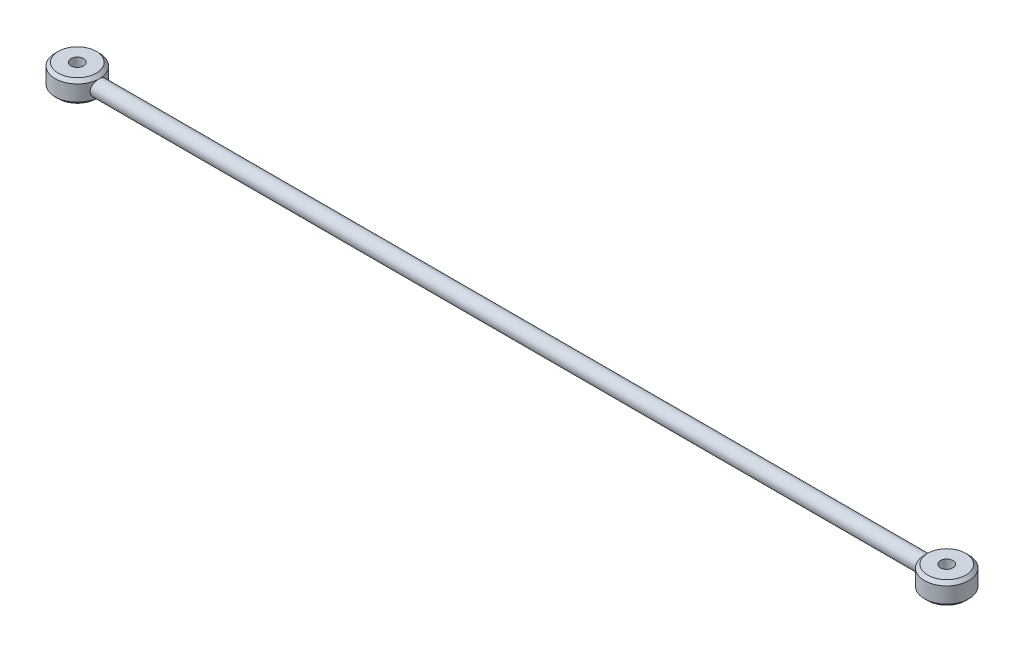
ISO-10303-21;
HEADER;
FILE_DESCRIPTION(('STEP AP214'),'2;1');
FILE_NAME('part.step','',(''),(''),'','','');
FILE_SCHEMA(('AUTOMOTIVE_DESIGN { 1 0 10303 214 1 1 1 1 }'));
ENDSEC;
DATA;
#1=APPLICATION_CONTEXT('core data for automotive mechanical design processes');
#2=APPLICATION_PROTOCOL_DEFINITION('international standard','automotive_design',2000,#1);
#3=PRODUCT_CONTEXT('',#1,'mechanical');
#4=PRODUCT('Part','Part','',(#3));
#5=PRODUCT_RELATED_PRODUCT_CATEGORY('part','',(#4));
#6=PRODUCT_DEFINITION_FORMATION('','',#4);
#7=PRODUCT_DEFINITION_CONTEXT('part definition',#1,'design');
#8=PRODUCT_DEFINITION('design','',#6,#7);
#9=PRODUCT_DEFINITION_SHAPE('','',#8);
#10=(LENGTH_UNIT() NAMED_UNIT(*) SI_UNIT(.MILLI.,.METRE.));
#11=(NAMED_UNIT(*) PLANE_ANGLE_UNIT() SI_UNIT($,.RADIAN.));
#12=(NAMED_UNIT(*) SI_UNIT($,.STERADIAN.) SOLID_ANGLE_UNIT());
#13=UNCERTAINTY_MEASURE_WITH_UNIT(LENGTH_MEASURE(1.E-05),#10,'distance_accuracy_value','');
#14=(GEOMETRIC_REPRESENTATION_CONTEXT(3) GLOBAL_UNCERTAINTY_ASSIGNED_CONTEXT((#13)) GLOBAL_UNIT_ASSIGNED_CONTEXT((#10,
#11,#12)) REPRESENTATION_CONTEXT('',''));
#15=CARTESIAN_POINT('',(0.,0.,0.));
#16=DIRECTION('',(0.,0.,1.));
#17=DIRECTION('',(1.,0.,0.));
#18=AXIS2_PLACEMENT_3D('',#15,#16,#17);
#19=CARTESIAN_POINT('',(0.,-3.5,0.));
#20=DIRECTION('',(0.,1.,0.));
#21=DIRECTION('',(0.,0.,1.));
#22=AXIS2_PLACEMENT_3D('',#19,#20,#21);
#23=CYLINDRICAL_SURFACE('',#22,7.);
#24=CARTESIAN_POINT('',(6.53834841531101,0.,-2.5));
#25=CARTESIAN_POINT('',(6.53834584824662,-0.135527062405663,-2.50000293142537));
#26=CARTESIAN_POINT('',(6.54260813914497,-0.271033863671456,-2.48894249442902));
#27=CARTESIAN_POINT('',(6.55909115270697,-0.537992919033548,-2.44517096849284));
#28=CARTESIAN_POINT('',(6.57131226844033,-0.669444972538477,-2.41245881021845));
#29=CARTESIAN_POINT('',(6.60215581723148,-0.924374759039168,-2.32671186637106));
#30=CARTESIAN_POINT('',(6.62076416275494,-1.04786933684221,-2.27372177606199));
#31=CARTESIAN_POINT('',(6.66226377845014,-1.28426086879935,-2.14907922668041));
#32=CARTESIAN_POINT('',(6.68515619613769,-1.39715497135356,-2.0774217654137));
#33=CARTESIAN_POINT('',(6.73379932254782,-1.61422119890982,-1.91402447589221));
#34=CARTESIAN_POINT('',(6.75962863426194,-1.71784786206316,-1.82158324114035));
#35=CARTESIAN_POINT('',(6.81057580348321,-1.90850684868181,-1.62073451198083));
#36=CARTESIAN_POINT('',(6.8356935259156,-1.99553603932801,-1.51232401016048));
#37=CARTESIAN_POINT('',(6.88331097797524,-2.15308908685254,-1.27854087761788));
#38=CARTESIAN_POINT('',(6.90570766813103,-2.22302949243019,-1.15275218770255));
#39=CARTESIAN_POINT('',(6.94442306763787,-2.34053505545395,-0.890255063415834));
#40=CARTESIAN_POINT('',(6.9607436747499,-2.38810720046781,-0.753550054799064));
#41=CARTESIAN_POINT('',(6.98491061598651,-2.45764094880007,-0.478828726649302));
#42=CARTESIAN_POINT('',(6.99306609346167,-2.48053956023552,-0.341077285205309));
#43=CARTESIAN_POINT('',(7.00108797904843,-2.50306838982769,-0.0634617212480525));
#44=CARTESIAN_POINT('',(7.0009568336799,-2.50270547565319,0.0764017655189457));
#45=CARTESIAN_POINT('',(6.99262260766838,-2.4792888024354,0.347592373494541));
#46=CARTESIAN_POINT('',(6.98478254135507,-2.4572554936179,0.479020651818556));
#47=CARTESIAN_POINT('',(6.96237851891869,-2.3928271488568,0.736174131701907));
#48=CARTESIAN_POINT('',(6.94781409330092,-2.35043069115005,0.861898934371373));
#49=CARTESIAN_POINT('',(6.91316507785892,-2.24595308417439,1.10616096680958));
#50=CARTESIAN_POINT('',(6.89300594264802,-2.18360423300557,1.22457268185839));
#51=CARTESIAN_POINT('',(6.84923357904069,-2.0412208599013,1.44953519587014));
#52=CARTESIAN_POINT('',(6.82561929883884,-1.96118094870148,1.55608236560633));
#53=CARTESIAN_POINT('',(6.77590353640076,-1.78066922406844,1.76033248031897));
#54=CARTESIAN_POINT('',(6.74973657984375,-1.67933309806731,1.85725678265592));
#55=CARTESIAN_POINT('',(6.69889962393309,-1.46165651256942,2.03301110882291));
#56=CARTESIAN_POINT('',(6.67422993264586,-1.34531298054457,2.11183741816384));
#57=CARTESIAN_POINT('',(6.62879124339515,-1.09812234808039,2.25045901136819));
#58=CARTESIAN_POINT('',(6.6081027649338,-0.967046933586725,2.30987563749326));
#59=CARTESIAN_POINT('',(6.57389739465231,-0.695820548060999,2.40551106572703));
#60=CARTESIAN_POINT('',(6.56037695532894,-0.555674104940762,2.44174134473282));
#61=CARTESIAN_POINT('',(6.54286005574888,-0.277916114231332,2.48828716066845));
#62=CARTESIAN_POINT('',(6.53841416370465,-0.140538187321998,2.49982704691603));
#63=CARTESIAN_POINT('',(6.53828418658321,0.134233375216714,2.50016897842258));
#64=CARTESIAN_POINT('',(6.54259819175289,0.271627000893788,2.48897597969827));
#65=CARTESIAN_POINT('',(6.55904904907211,0.536573774727313,2.44527599545485));
#66=CARTESIAN_POINT('',(6.57085417549385,0.664298743576927,2.41367185988826));
#67=CARTESIAN_POINT('',(6.60057618928644,0.912589914993619,2.33115923950034));
#68=CARTESIAN_POINT('',(6.6184942567719,1.03315472999922,2.2802470270069));
#69=CARTESIAN_POINT('',(6.65919897877472,1.26840017748808,2.15854403482729));
#70=CARTESIAN_POINT('',(6.68213439822037,1.38272592578259,2.08711845508965));
#71=CARTESIAN_POINT('',(6.73002297450369,1.59820772080303,1.92711056207351));
#72=CARTESIAN_POINT('',(6.75497680677526,1.69935932918255,1.83852249165407));
#73=CARTESIAN_POINT('',(6.80579566439709,1.89154268999623,1.64077043500406));
#74=CARTESIAN_POINT('',(6.83163247928111,1.98167938546273,1.53072651663186));
#75=CARTESIAN_POINT('',(6.87993729369829,2.14229268505071,1.29643714363478));
#76=CARTESIAN_POINT('',(6.90240534953732,2.21276961778492,1.17219192643341));
#77=CARTESIAN_POINT('',(6.94137984159745,2.33150022340817,0.91338047392643));
#78=CARTESIAN_POINT('',(6.95791626179403,2.37986601746067,0.778870439322977));
#79=CARTESIAN_POINT('',(6.9832833598311,2.45304685905716,0.50290689892174));
#80=CARTESIAN_POINT('',(6.99211728252105,2.47787182408849,0.361456343526464));
#81=CARTESIAN_POINT('',(7.0008038188261,2.50227296664434,0.0837575092861369));
#82=CARTESIAN_POINT('',(7.00111065426498,2.50312610644893,-0.0523654499558729));
#83=CARTESIAN_POINT('',(6.99386365091442,2.48278462301327,-0.322726803691473));
#84=CARTESIAN_POINT('',(6.98631061639184,2.46159225559553,-0.456965389580549));
#85=CARTESIAN_POINT('',(6.96438311073992,2.39863987070442,-0.716981322330597));
#86=CARTESIAN_POINT('',(6.95015128080456,2.35730927663153,-0.842875555999297));
#87=CARTESIAN_POINT('',(6.91633887698632,2.25566690926909,-1.08597143426168));
#88=CARTESIAN_POINT('',(6.8967573009467,2.19535157928641,-1.20317144494909));
#89=CARTESIAN_POINT('',(6.85325490485467,2.05468864767617,-1.43068233807408));
#90=CARTESIAN_POINT('',(6.82919171160486,1.97363552490154,-1.54052934900393));
#91=CARTESIAN_POINT('',(6.77971046047431,1.79494754080834,-1.74546847276757));
#92=CARTESIAN_POINT('',(6.75429194159098,1.69730701241678,-1.84055552155398));
#93=CARTESIAN_POINT('',(6.70352883842234,1.48278117282576,-2.01782220864538));
#94=CARTESIAN_POINT('',(6.67824313001613,1.36521012258064,-2.09919180205207));
#95=CARTESIAN_POINT('',(6.63200351602705,1.11726158568969,-2.24100798811166));
#96=CARTESIAN_POINT('',(6.61104931825108,0.986884963752214,-2.30145599226941));
#97=CARTESIAN_POINT('',(6.57609213229057,0.716259076161108,-2.39953333207331));
#98=CARTESIAN_POINT('',(6.56211826403834,0.57597119362146,-2.43706721874483));
#99=CARTESIAN_POINT('',(6.54325005921779,0.290446106468545,-2.48729274825372));
#100=CARTESIAN_POINT('',(6.53835116581018,0.145211423135784,-2.4999968591037));
#101=CARTESIAN_POINT('',(6.53834841531101,0.,-2.5));
#102=B_SPLINE_CURVE_WITH_KNOTS('',3,(#24,#25,#26,#27,#28,#29,#30,#31,#32,#33,#34,#35,#36,#37,
#38,#39,#40,#41,#42,#43,#44,#45,#46,#47,#48,#49,#50,#51,#52,#53,#54,#55,#56,#57,#58,#59,#60,#61,
#62,#63,#64,#65,#66,#67,#68,#69,#70,#71,#72,#73,#74,#75,#76,#77,#78,#79,#80,#81,#82,#83,#84,#85,
#86,#87,#88,#89,#90,#91,#92,#93,#94,#95,#96,#97,#98,#99,#100,#101),.UNSPECIFIED.,.T.,.F.,(4,2,2,
2,2,2,2,2,2,2,2,2,2,2,2,2,2,2,2,2,2,2,2,2,2,2,2,2,2,2,2,2,2,2,2,2,2,2,4),(0.,0.406041766331001,
0.812103587736961,1.21727550243125,1.62255610072681,2.04441002530116,2.46634349733964,
2.90112813694272,3.33577686482073,3.75326460234542,4.17062908250815,4.56923737347846,
4.96787349948484,5.37209971069683,5.77644923231493,6.20244167773848,6.62852147719004,
7.06247609308417,7.4962157414176,7.90789453596191,8.31948358967585,8.71400941843618,
9.10861145427952,9.5170588594572,9.92564351590594,10.3573204832378,10.7889902346611,
11.2184461110406,11.6477209819893,12.0540827015585,12.4604028439597,12.8584146445103,
13.2565010549614,13.67053016118,14.0847010056159,14.5182116217954,14.9516929848591,
15.386967912939,15.8220242160484),.UNSPECIFIED.);
#103=CARTESIAN_POINT('',(7.00000000000118,2.50000000000329,3.27181081405049E-13));
#104=VERTEX_POINT('',#103);
#105=CARTESIAN_POINT('',(7.00000000000099,-2.50000000000278,2.71449619716625E-13));
#106=VERTEX_POINT('',#105);
#107=EDGE_CURVE('E145',#104,#106,#102,.T.);
#108=ORIENTED_EDGE('',*,*,#107,.T.);
#109=CARTESIAN_POINT('',(0.,-2.50000000000003,0.));
#110=DIRECTION('',(0.,1.,0.));
#111=DIRECTION('',(0.,0.,1.));
#112=AXIS2_PLACEMENT_3D('',#109,#110,#111);
#113=CIRCLE('',#112,7.);
#114=EDGE_CURVE('E57',#106,#106,#113,.T.);
#115=ORIENTED_EDGE('',*,*,#114,.T.);
#116=EDGE_CURVE('E146',#106,#104,#102,.T.);
#117=ORIENTED_EDGE('',*,*,#116,.T.);
#118=CARTESIAN_POINT('',(0.,2.50000000000006,0.));
#119=DIRECTION('',(0.,1.,0.));
#120=DIRECTION('',(0.,0.,1.));
#121=AXIS2_PLACEMENT_3D('',#118,#119,#120);
#122=CIRCLE('',#121,7.);
#123=EDGE_CURVE('E52',#104,#104,#122,.F.);
#124=ORIENTED_EDGE('',*,*,#123,.T.);
#125=EDGE_LOOP('',(#108,#115,#117,#124));
#126=FACE_BOUND('',#125,.T.);
#127=ADVANCED_FACE('F38',(#126),#23,.T.);
#128=CARTESIAN_POINT('',(0.,-3.5,0.));
#129=DIRECTION('',(0.,1.,0.));
#130=DIRECTION('',(0.,0.,1.));
#131=AXIS2_PLACEMENT_3D('',#128,#129,#130);
#132=PLANE('',#131);
#133=CARTESIAN_POINT('',(0.,-3.5,0.));
#134=DIRECTION('',(0.,1.,0.));
#135=DIRECTION('',(0.,0.,1.));
#136=AXIS2_PLACEMENT_3D('',#133,#134,#135);
#137=CIRCLE('',#136,6.00000000000001);
#138=CARTESIAN_POINT('',(0.,-3.5,6.00000000000001));
#139=VERTEX_POINT('',#138);
#140=EDGE_CURVE('E47',#139,#139,#137,.F.);
#141=ORIENTED_EDGE('',*,*,#140,.T.);
#142=EDGE_LOOP('',(#141));
#143=FACE_BOUND('',#142,.T.);
#144=CARTESIAN_POINT('',(0.,-3.5,0.));
#145=DIRECTION('',(0.,1.,0.));
#146=DIRECTION('',(0.,0.,1.));
#147=AXIS2_PLACEMENT_3D('',#144,#145,#146);
#148=CIRCLE('',#147,2.);
#149=CARTESIAN_POINT('',(0.,-3.5,2.));
#150=VERTEX_POINT('',#149);
#151=EDGE_CURVE('E73',#150,#150,#148,.T.);
#152=ORIENTED_EDGE('',*,*,#151,.T.);
#153=EDGE_LOOP('',(#152));
#154=FACE_BOUND('',#153,.T.);
#155=ADVANCED_FACE('F92',(#143,#154),#132,.F.);
#156=CARTESIAN_POINT('',(0.,-3.5,0.));
#157=DIRECTION('',(0.,1.,0.));
#158=DIRECTION('',(0.,0.,1.));
#159=AXIS2_PLACEMENT_3D('',#156,#157,#158);
#160=CYLINDRICAL_SURFACE('',#159,2.);
#161=ORIENTED_EDGE('',*,*,#151,.F.);
#162=EDGE_LOOP('',(#161));
#163=FACE_BOUND('',#162,.T.);
#164=CARTESIAN_POINT('',(0.,3.5,0.));
#165=DIRECTION('',(0.,1.,0.));
#166=DIRECTION('',(0.,0.,1.));
#167=AXIS2_PLACEMENT_3D('',#164,#165,#166);
#168=CIRCLE('',#167,2.);
#169=CARTESIAN_POINT('',(0.,3.5,2.));
#170=VERTEX_POINT('',#169);
#171=EDGE_CURVE('E79',#170,#170,#168,.T.);
#172=ORIENTED_EDGE('',*,*,#171,.T.);
#173=EDGE_LOOP('',(#172));
#174=FACE_BOUND('',#173,.T.);
#175=ADVANCED_FACE('F110',(#163,#174),#160,.F.);
#176=CARTESIAN_POINT('',(0.,3.5,0.));
#177=DIRECTION('',(0.,1.,0.));
#178=DIRECTION('',(0.,0.,1.));
#179=AXIS2_PLACEMENT_3D('',#176,#177,#178);
#180=PLANE('',#179);
#181=CARTESIAN_POINT('',(0.,3.5,0.));
#182=DIRECTION('',(0.,1.,0.));
#183=DIRECTION('',(0.,0.,1.));
#184=AXIS2_PLACEMENT_3D('',#181,#182,#183);
#185=CIRCLE('',#184,6.00000000000003);
#186=CARTESIAN_POINT('',(0.,3.5,6.00000000000003));
#187=VERTEX_POINT('',#186);
#188=EDGE_CURVE('E11',#187,#187,#185,.T.);
#189=ORIENTED_EDGE('',*,*,#188,.T.);
#190=EDGE_LOOP('',(#189));
#191=FACE_BOUND('',#190,.T.);
#192=ORIENTED_EDGE('',*,*,#171,.F.);
#193=EDGE_LOOP('',(#192));
#194=FACE_BOUND('',#193,.T.);
#195=ADVANCED_FACE('F222',(#191,#194),#180,.T.);
#196=CARTESIAN_POINT('',(282.001,0.,0.));
#197=DIRECTION('',(-1.,0.,0.));
#198=DIRECTION('',(0.,0.,1.));
#199=AXIS2_PLACEMENT_3D('',#196,#197,#198);
#200=CYLINDRICAL_SURFACE('',#199,2.5);
#201=CARTESIAN_POINT('',(268.461651584689,0.,2.5));
#202=CARTESIAN_POINT('',(268.461654151753,0.135527062405663,2.50000293142537));
#203=CARTESIAN_POINT('',(268.457391860855,0.271033863671457,2.48894249442902));
#204=CARTESIAN_POINT('',(268.440908847293,0.537992919033548,2.44517096849284));
#205=CARTESIAN_POINT('',(268.42868773156,0.669444972538476,2.41245881021845));
#206=CARTESIAN_POINT('',(268.397844182769,0.924374759039166,2.32671186637106));
#207=CARTESIAN_POINT('',(268.379235837245,1.04786933684221,2.27372177606199));
#208=CARTESIAN_POINT('',(268.33773622155,1.28426086879935,2.14907922668042));
#209=CARTESIAN_POINT('',(268.314843803862,1.39715497135355,2.07742176541371));
#210=CARTESIAN_POINT('',(268.266200677452,1.61422119890981,1.91402447589222));
#211=CARTESIAN_POINT('',(268.240371365738,1.71784786206315,1.82158324114036));
#212=CARTESIAN_POINT('',(268.189424196517,1.90850684868181,1.62073451198084));
#213=CARTESIAN_POINT('',(268.164306474084,1.99553603932801,1.51232401016048));
#214=CARTESIAN_POINT('',(268.116689022025,2.15308908685253,1.27854087761788));
#215=CARTESIAN_POINT('',(268.094292331869,2.22302949243018,1.15275218770255));
#216=CARTESIAN_POINT('',(268.055576932362,2.34053505545395,0.890255063415836));
#217=CARTESIAN_POINT('',(268.03925632525,2.38810720046781,0.753550054799067));
#218=CARTESIAN_POINT('',(268.015089384014,2.45764094880007,0.478828726649304));
#219=CARTESIAN_POINT('',(268.006933906538,2.48053956023552,0.34107728520531));
#220=CARTESIAN_POINT('',(267.998912020952,2.50306838982769,0.0634617212480522));
#221=CARTESIAN_POINT('',(267.99904316632,2.50270547565319,-0.0764017655189457));
#222=CARTESIAN_POINT('',(268.007377392332,2.4792888024354,-0.347592373494542));
#223=CARTESIAN_POINT('',(268.015217458645,2.45725549361789,-0.479020651818558));
#224=CARTESIAN_POINT('',(268.037621481081,2.3928271488568,-0.736174131701908));
#225=CARTESIAN_POINT('',(268.052185906699,2.35043069115005,-0.861898934371372));
#226=CARTESIAN_POINT('',(268.086834922141,2.24595308417439,-1.10616096680958));
#227=CARTESIAN_POINT('',(268.106994057352,2.18360423300557,-1.22457268185838));
#228=CARTESIAN_POINT('',(268.150766420959,2.0412208599013,-1.44953519587014));
#229=CARTESIAN_POINT('',(268.174380701161,1.96118094870148,-1.55608236560633));
#230=CARTESIAN_POINT('',(268.224096463599,1.78066922406844,-1.76033248031897));
#231=CARTESIAN_POINT('',(268.250263420156,1.67933309806731,-1.85725678265592));
#232=CARTESIAN_POINT('',(268.301100376067,1.46165651256941,-2.03301110882291));
#233=CARTESIAN_POINT('',(268.325770067354,1.34531298054457,-2.11183741816384));
#234=CARTESIAN_POINT('',(268.371208756605,1.09812234808039,-2.25045901136819));
#235=CARTESIAN_POINT('',(268.391897235066,0.967046933586726,-2.30987563749326));
#236=CARTESIAN_POINT('',(268.426102605348,0.695820548061,-2.40551106572703));
#237=CARTESIAN_POINT('',(268.439623044671,0.555674104940763,-2.44174134473282));
#238=CARTESIAN_POINT('',(268.457139944251,0.277916114231331,-2.48828716066845));
#239=CARTESIAN_POINT('',(268.461585836295,0.140538187321997,-2.49982704691603));
#240=CARTESIAN_POINT('',(268.461715813417,-0.134233375216715,-2.50016897842258));
#241=CARTESIAN_POINT('',(268.457401808247,-0.271627000893789,-2.48897597969827));
#242=CARTESIAN_POINT('',(268.440950950928,-0.536573774727316,-2.44527599545485));
#243=CARTESIAN_POINT('',(268.429145824506,-0.664298743576933,-2.41367185988826));
#244=CARTESIAN_POINT('',(268.399423810714,-0.912589914993626,-2.33115923950033));
#245=CARTESIAN_POINT('',(268.381505743228,-1.03315472999923,-2.2802470270069));
#246=CARTESIAN_POINT('',(268.340801021225,-1.26840017748809,-2.15854403482728));
#247=CARTESIAN_POINT('',(268.31786560178,-1.38272592578261,-2.08711845508964));
#248=CARTESIAN_POINT('',(268.269977025496,-1.59820772080304,-1.9271105620735));
#249=CARTESIAN_POINT('',(268.245023193225,-1.69935932918256,-1.83852249165406));
#250=CARTESIAN_POINT('',(268.194204335603,-1.89154268999624,-1.64077043500405));
#251=CARTESIAN_POINT('',(268.168367520719,-1.98167938546273,-1.53072651663186));
#252=CARTESIAN_POINT('',(268.120062706302,-2.14229268505071,-1.29643714363478));
#253=CARTESIAN_POINT('',(268.097594650463,-2.21276961778492,-1.1721919264334));
#254=CARTESIAN_POINT('',(268.058620158403,-2.33150022340817,-0.913380473926427));
#255=CARTESIAN_POINT('',(268.042083738206,-2.37986601746067,-0.778870439322973));
#256=CARTESIAN_POINT('',(268.016716640169,-2.45304685905716,-0.502906898921732));
#257=CARTESIAN_POINT('',(268.007882717479,-2.47787182408849,-0.361456343526455));
#258=CARTESIAN_POINT('',(267.999196181174,-2.50227296664434,-0.0837575092861269));
#259=CARTESIAN_POINT('',(267.998889345735,-2.50312610644893,0.052365449955881));
#260=CARTESIAN_POINT('',(268.006136349086,-2.48278462301327,0.322726803691478));
#261=CARTESIAN_POINT('',(268.013689383608,-2.46159225559553,0.456965389580553));
#262=CARTESIAN_POINT('',(268.03561688926,-2.39863987070442,0.716981322330601));
#263=CARTESIAN_POINT('',(268.049848719195,-2.35730927663152,0.842875555999301));
#264=CARTESIAN_POINT('',(268.083661123014,-2.25566690926909,1.08597143426168));
#265=CARTESIAN_POINT('',(268.103242699053,-2.19535157928641,1.20317144494909));
#266=CARTESIAN_POINT('',(268.146745095145,-2.05468864767617,1.43068233807407));
#267=CARTESIAN_POINT('',(268.170808288395,-1.97363552490155,1.54052934900393));
#268=CARTESIAN_POINT('',(268.220289539526,-1.79494754080834,1.74546847276756));
#269=CARTESIAN_POINT('',(268.245708058409,-1.69730701241678,1.84055552155398));
#270=CARTESIAN_POINT('',(268.296471161578,-1.48278117282576,2.01782220864538));
#271=CARTESIAN_POINT('',(268.321756869984,-1.36521012258064,2.09919180205207));
#272=CARTESIAN_POINT('',(268.367996483973,-1.11726158568969,2.24100798811165));
#273=CARTESIAN_POINT('',(268.388950681749,-0.986884963752213,2.30145599226941));
#274=CARTESIAN_POINT('',(268.423907867709,-0.716259076161105,2.39953333207332));
#275=CARTESIAN_POINT('',(268.437881735962,-0.575971193621457,2.43706721874483));
#276=CARTESIAN_POINT('',(268.456749940782,-0.290446106468542,2.48729274825372));
#277=CARTESIAN_POINT('',(268.46164883419,-0.145211423135783,2.4999968591037));
#278=CARTESIAN_POINT('',(268.461651584689,0.,2.5));
#279=B_SPLINE_CURVE_WITH_KNOTS('',3,(#201,#202,#203,#204,#205,#206,#207,#208,#209,#210,#211,
#212,#213,#214,#215,#216,#217,#218,#219,#220,#221,#222,#223,#224,#225,#226,#227,#228,#229,#230,
#231,#232,#233,#234,#235,#236,#237,#238,#239,#240,#241,#242,#243,#244,#245,#246,#247,#248,#249,
#250,#251,#252,#253,#254,#255,#256,#257,#258,#259,#260,#261,#262,#263,#264,#265,#266,#267,#268,
#269,#270,#271,#272,#273,#274,#275,#276,#277,#278),.UNSPECIFIED.,.T.,.F.,(4,2,2,2,2,2,2,2,2,2,2,
2,2,2,2,2,2,2,2,2,2,2,2,2,2,2,2,2,2,2,2,2,2,2,2,2,2,2,4),(0.,0.406041766331003,
0.812103587736962,1.21727550243125,1.6225561007268,2.04441002530115,2.46634349733963,
2.90112813694271,3.33577686482073,3.75326460234542,4.17062908250815,4.56923737347846,
4.96787349948483,5.37209971069682,5.77644923231493,6.20244167773848,6.62852147719004,
7.06247609308417,7.49621574141759,7.90789453596191,8.31948358967585,8.71400941843618,
9.10861145427952,9.51705885945722,9.92564351590595,10.3573204832378,10.7889902346611,
11.2184461110406,11.6477209819893,12.0540827015585,12.4604028439597,12.8584146445103,
13.2565010549614,13.67053016118,14.0847010056159,14.5182116217954,14.9516929848591,
15.386967912939,15.8220242160484),.UNSPECIFIED.);
#280=CARTESIAN_POINT('',(267.999999999999,2.50000000000278,-2.71449622198167E-13));
#281=VERTEX_POINT('',#280);
#282=CARTESIAN_POINT('',(267.999999999999,-2.50000000000329,-3.27181070651701E-13));
#283=VERTEX_POINT('',#282);
#284=EDGE_CURVE('E138',#281,#283,#279,.T.);
#285=ORIENTED_EDGE('',*,*,#284,.T.);
#286=EDGE_CURVE('E139',#283,#281,#279,.T.);
#287=ORIENTED_EDGE('',*,*,#286,.T.);
#288=EDGE_LOOP('',(#285,#287));
#289=FACE_BOUND('',#288,.T.);
#290=ORIENTED_EDGE('',*,*,#116,.F.);
#291=ORIENTED_EDGE('',*,*,#107,.F.);
#292=EDGE_LOOP('',(#290,#291));
#293=FACE_BOUND('',#292,.T.);
#294=ADVANCED_FACE('F143',(#289,#293),#200,.T.);
#295=CARTESIAN_POINT('',(275.,-3.5,0.));
#296=DIRECTION('',(0.,1.,0.));
#297=DIRECTION('',(0.,0.,1.));
#298=AXIS2_PLACEMENT_3D('',#295,#296,#297);
#299=CYLINDRICAL_SURFACE('',#298,6.99999999999999);
#300=ORIENTED_EDGE('',*,*,#286,.F.);
#301=CARTESIAN_POINT('',(275.,-2.49999999999996,0.));
#302=DIRECTION('',(0.,1.,0.));
#303=DIRECTION('',(0.,0.,1.));
#304=AXIS2_PLACEMENT_3D('',#301,#302,#303);
#305=CIRCLE('',#304,6.99999999999999);
#306=EDGE_CURVE('E72',#283,#283,#305,.T.);
#307=ORIENTED_EDGE('',*,*,#306,.T.);
#308=ORIENTED_EDGE('',*,*,#284,.F.);
#309=CARTESIAN_POINT('',(275.,2.50000000000008,0.));
#310=DIRECTION('',(0.,1.,0.));
#311=DIRECTION('',(0.,0.,1.));
#312=AXIS2_PLACEMENT_3D('',#309,#310,#311);
#313=CIRCLE('',#312,6.99999999999999);
#314=EDGE_CURVE('E65',#281,#281,#313,.F.);
#315=ORIENTED_EDGE('',*,*,#314,.T.);
#316=EDGE_LOOP('',(#300,#307,#308,#315));
#317=FACE_BOUND('',#316,.T.);
#318=ADVANCED_FACE('F136',(#317),#299,.T.);
#319=CARTESIAN_POINT('',(275.,-3.5,0.));
#320=DIRECTION('',(0.,1.,0.));
#321=DIRECTION('',(0.,0.,1.));
#322=AXIS2_PLACEMENT_3D('',#319,#320,#321);
#323=PLANE('',#322);
#324=CARTESIAN_POINT('',(275.,-3.5,0.));
#325=DIRECTION('',(0.,1.,0.));
#326=DIRECTION('',(0.,0.,1.));
#327=AXIS2_PLACEMENT_3D('',#324,#325,#326);
#328=CIRCLE('',#327,5.99999999999995);
#329=CARTESIAN_POINT('',(275.,-3.5,5.99999999999995));
#330=VERTEX_POINT('',#329);
#331=EDGE_CURVE('E76',#330,#330,#328,.F.);
#332=ORIENTED_EDGE('',*,*,#331,.T.);
#333=EDGE_LOOP('',(#332));
#334=FACE_BOUND('',#333,.T.);
#335=CARTESIAN_POINT('',(275.,-3.5,0.));
#336=DIRECTION('',(0.,1.,0.));
#337=DIRECTION('',(0.,0.,1.));
#338=AXIS2_PLACEMENT_3D('',#335,#336,#337);
#339=CIRCLE('',#338,2.);
#340=CARTESIAN_POINT('',(275.,-3.5,2.));
#341=VERTEX_POINT('',#340);
#342=EDGE_CURVE('E141',#341,#341,#339,.T.);
#343=ORIENTED_EDGE('',*,*,#342,.T.);
#344=EDGE_LOOP('',(#343));
#345=FACE_BOUND('',#344,.T.);
#346=ADVANCED_FACE('F165',(#334,#345),#323,.F.);
#347=CARTESIAN_POINT('',(275.,-3.5,0.));
#348=DIRECTION('',(0.,1.,0.));
#349=DIRECTION('',(0.,0.,1.));
#350=AXIS2_PLACEMENT_3D('',#347,#348,#349);
#351=CYLINDRICAL_SURFACE('',#350,2.);
#352=ORIENTED_EDGE('',*,*,#342,.F.);
#353=EDGE_LOOP('',(#352));
#354=FACE_BOUND('',#353,.T.);
#355=CARTESIAN_POINT('',(275.,3.5,0.));
#356=DIRECTION('',(0.,1.,0.));
#357=DIRECTION('',(0.,0.,1.));
#358=AXIS2_PLACEMENT_3D('',#355,#356,#357);
#359=CIRCLE('',#358,2.);
#360=CARTESIAN_POINT('',(275.,3.5,2.));
#361=VERTEX_POINT('',#360);
#362=EDGE_CURVE('E180',#361,#361,#359,.T.);
#363=ORIENTED_EDGE('',*,*,#362,.T.);
#364=EDGE_LOOP('',(#363));
#365=FACE_BOUND('',#364,.T.);
#366=ADVANCED_FACE('F131',(#354,#365),#351,.F.);
#367=CARTESIAN_POINT('',(275.,3.5,0.));
#368=DIRECTION('',(0.,1.,0.));
#369=DIRECTION('',(0.,0.,1.));
#370=AXIS2_PLACEMENT_3D('',#367,#368,#369);
#371=PLANE('',#370);
#372=CARTESIAN_POINT('',(275.,3.5,0.));
#373=DIRECTION('',(0.,1.,0.));
#374=DIRECTION('',(0.,0.,1.));
#375=AXIS2_PLACEMENT_3D('',#372,#373,#374);
#376=CIRCLE('',#375,6.00000000000003);
#377=CARTESIAN_POINT('',(275.,3.5,6.00000000000003));
#378=VERTEX_POINT('',#377);
#379=EDGE_CURVE('E85',#378,#378,#376,.T.);
#380=ORIENTED_EDGE('',*,*,#379,.T.);
#381=EDGE_LOOP('',(#380));
#382=FACE_BOUND('',#381,.T.);
#383=ORIENTED_EDGE('',*,*,#362,.F.);
#384=EDGE_LOOP('',(#383));
#385=FACE_BOUND('',#384,.T.);
#386=ADVANCED_FACE('F120',(#382,#385),#371,.T.);
#387=CARTESIAN_POINT('',(275.,-2.49999999999996,0.));
#388=DIRECTION('',(0.,1.,0.));
#389=DIRECTION('',(0.,0.,1.));
#390=AXIS2_PLACEMENT_3D('',#387,#388,#389);
#391=CONICAL_SURFACE('',#390,6.99999999999999,0.785398163397447);
#392=ORIENTED_EDGE('',*,*,#331,.F.);
#393=EDGE_LOOP('',(#392));
#394=FACE_BOUND('',#393,.T.);
#395=ORIENTED_EDGE('',*,*,#306,.F.);
#396=EDGE_LOOP('',(#395));
#397=FACE_BOUND('',#396,.T.);
#398=ADVANCED_FACE('F101',(#394,#397),#391,.T.);
#399=CARTESIAN_POINT('',(275.,3.5,0.));
#400=DIRECTION('',(0.,-1.,0.));
#401=DIRECTION('',(0.,0.,-1.));
#402=AXIS2_PLACEMENT_3D('',#399,#400,#401);
#403=CONICAL_SURFACE('',#402,6.00000000000003,0.785398163397464);
#404=ORIENTED_EDGE('',*,*,#314,.F.);
#405=EDGE_LOOP('',(#404));
#406=FACE_BOUND('',#405,.T.);
#407=ORIENTED_EDGE('',*,*,#379,.F.);
#408=EDGE_LOOP('',(#407));
#409=FACE_BOUND('',#408,.T.);
#410=ADVANCED_FACE('F66',(#406,#409),#403,.T.);
#411=CARTESIAN_POINT('',(0.,-2.50000000000003,0.));
#412=DIRECTION('',(0.,1.,0.));
#413=DIRECTION('',(0.,0.,1.));
#414=AXIS2_PLACEMENT_3D('',#411,#412,#413);
#415=CONICAL_SURFACE('',#414,7.,0.78539816339746);
#416=ORIENTED_EDGE('',*,*,#140,.F.);
#417=EDGE_LOOP('',(#416));
#418=FACE_BOUND('',#417,.T.);
#419=ORIENTED_EDGE('',*,*,#114,.F.);
#420=EDGE_LOOP('',(#419));
#421=FACE_BOUND('',#420,.T.);
#422=ADVANCED_FACE('F95',(#418,#421),#415,.T.);
#423=CARTESIAN_POINT('',(0.,3.5,0.));
#424=DIRECTION('',(0.,-1.,0.));
#425=DIRECTION('',(0.,0.,-1.));
#426=AXIS2_PLACEMENT_3D('',#423,#424,#425);
#427=CONICAL_SURFACE('',#426,6.00000000000003,0.785398163397464);
#428=ORIENTED_EDGE('',*,*,#123,.F.);
#429=EDGE_LOOP('',(#428));
#430=FACE_BOUND('',#429,.T.);
#431=ORIENTED_EDGE('',*,*,#188,.F.);
#432=EDGE_LOOP('',(#431));
#433=FACE_BOUND('',#432,.T.);
#434=ADVANCED_FACE('F41',(#430,#433),#427,.T.);
#435=CLOSED_SHELL('',(#127,#155,#175,#195,#294,#318,#346,#366,#386,#398,#410,#422,#434));
#436=MANIFOLD_SOLID_BREP('B2',#435);
#437=ADVANCED_BREP_SHAPE_REPRESENTATION('',(#18,#436),#14);
#438=SHAPE_DEFINITION_REPRESENTATION(#9,#437);
ENDSEC;
END-ISO-10303-21;
